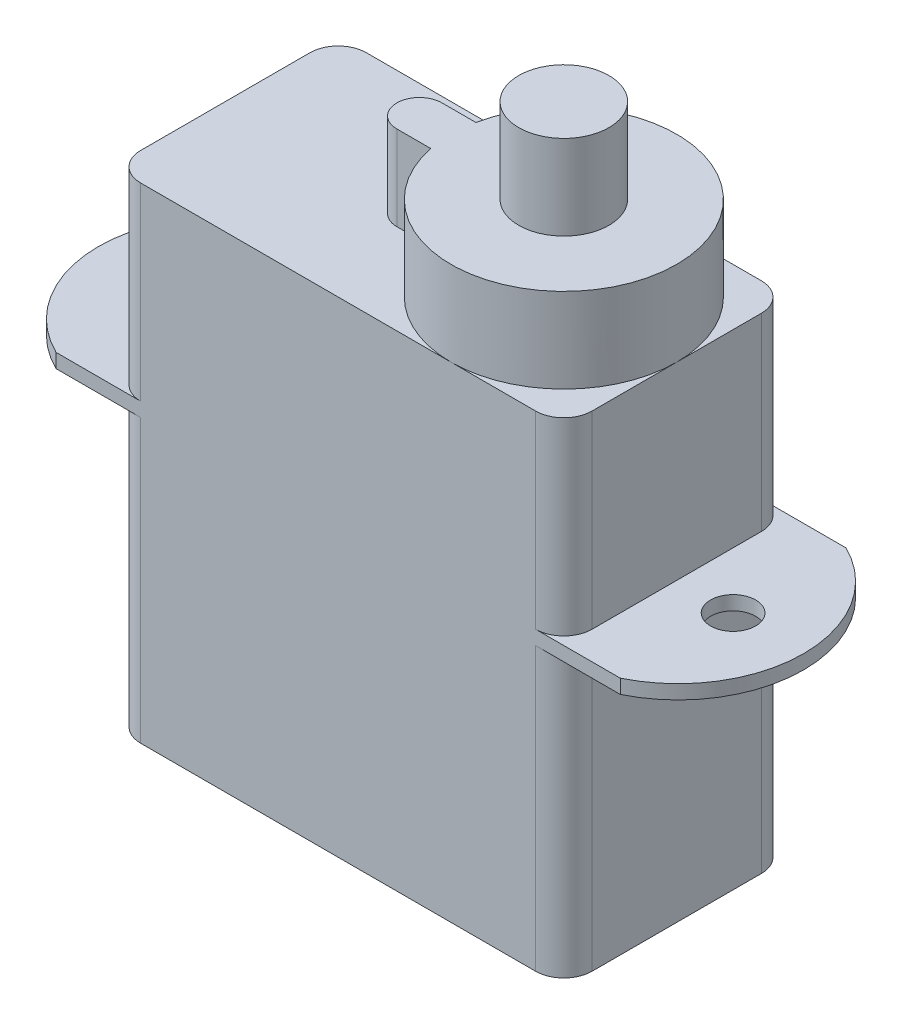
ISO-10303-21;
HEADER;
FILE_DESCRIPTION(('STEP AP214'),'2;1');
FILE_NAME('part.step','',(''),(''),'','','');
FILE_SCHEMA(('AUTOMOTIVE_DESIGN { 1 0 10303 214 1 1 1 1 }'));
ENDSEC;
DATA;
#1=APPLICATION_CONTEXT('core data for automotive mechanical design processes');
#2=APPLICATION_PROTOCOL_DEFINITION('international standard','automotive_design',2000,#1);
#3=PRODUCT_CONTEXT('',#1,'mechanical');
#4=PRODUCT('Part','Part','',(#3));
#5=PRODUCT_RELATED_PRODUCT_CATEGORY('part','',(#4));
#6=PRODUCT_DEFINITION_FORMATION('','',#4);
#7=PRODUCT_DEFINITION_CONTEXT('part definition',#1,'design');
#8=PRODUCT_DEFINITION('design','',#6,#7);
#9=PRODUCT_DEFINITION_SHAPE('','',#8);
#10=(LENGTH_UNIT() NAMED_UNIT(*) SI_UNIT(.MILLI.,.METRE.));
#11=(NAMED_UNIT(*) PLANE_ANGLE_UNIT() SI_UNIT($,.RADIAN.));
#12=(NAMED_UNIT(*) SI_UNIT($,.STERADIAN.) SOLID_ANGLE_UNIT());
#13=UNCERTAINTY_MEASURE_WITH_UNIT(LENGTH_MEASURE(1.E-05),#10,'distance_accuracy_value','');
#14=(GEOMETRIC_REPRESENTATION_CONTEXT(3) GLOBAL_UNCERTAINTY_ASSIGNED_CONTEXT((#13)) GLOBAL_UNIT_ASSIGNED_CONTEXT((#10,
#11,#12)) REPRESENTATION_CONTEXT('',''));
#15=CARTESIAN_POINT('',(0.,0.,0.));
#16=DIRECTION('',(0.,0.,1.));
#17=DIRECTION('',(1.,0.,0.));
#18=AXIS2_PLACEMENT_3D('',#15,#16,#17);
#19=CARTESIAN_POINT('',(-7.,17.2,-3.));
#20=DIRECTION('',(0.,1.,0.));
#21=DIRECTION('',(0.,0.,1.));
#22=AXIS2_PLACEMENT_3D('',#19,#20,#21);
#23=PLANE('',#22);
#24=CARTESIAN_POINT('',(4.,17.2,0.));
#25=DIRECTION('',(0.,1.,0.));
#26=DIRECTION('',(0.,0.,1.));
#27=AXIS2_PLACEMENT_3D('',#24,#25,#26);
#28=CIRCLE('',#27,4.);
#29=CARTESIAN_POINT('',(8.,17.2,0.));
#30=VERTEX_POINT('',#29);
#31=CARTESIAN_POINT('',(4.,17.2,-4.));
#32=VERTEX_POINT('',#31);
#33=EDGE_CURVE('E11',#30,#32,#28,.T.);
#34=ORIENTED_EDGE('',*,*,#33,.F.);
#35=DIRECTION('',(0.,0.,-1.));
#36=VECTOR('',#35,1.);
#37=CARTESIAN_POINT('',(8.,17.2,3.));
#38=LINE('',#37,#36);
#39=CARTESIAN_POINT('',(8.,17.2,-3.));
#40=VERTEX_POINT('',#39);
#41=EDGE_CURVE('E266',#30,#40,#38,.T.);
#42=ORIENTED_EDGE('',*,*,#41,.T.);
#43=CARTESIAN_POINT('',(7.,17.2,-3.));
#44=DIRECTION('',(0.,1.,0.));
#45=DIRECTION('',(0.,0.,1.));
#46=AXIS2_PLACEMENT_3D('',#43,#44,#45);
#47=CIRCLE('',#46,1.);
#48=CARTESIAN_POINT('',(7.,17.2,-4.));
#49=VERTEX_POINT('',#48);
#50=EDGE_CURVE('E271',#40,#49,#47,.T.);
#51=ORIENTED_EDGE('',*,*,#50,.T.);
#52=DIRECTION('',(-1.,0.,0.));
#53=VECTOR('',#52,1.);
#54=CARTESIAN_POINT('',(7.,17.2,-4.));
#55=LINE('',#54,#53);
#56=EDGE_CURVE('E275',#49,#32,#55,.T.);
#57=ORIENTED_EDGE('',*,*,#56,.T.);
#58=EDGE_LOOP('',(#34,#42,#51,#57));
#59=FACE_BOUND('',#58,.T.);
#60=ADVANCED_FACE('F39',(#59),#23,.T.);
#61=CARTESIAN_POINT('',(0.080816411546912,17.2,-0.8));
#62=VERTEX_POINT('',#61);
#63=EDGE_CURVE('E49',#32,#62,#28,.T.);
#64=ORIENTED_EDGE('',*,*,#63,.F.);
#65=CARTESIAN_POINT('',(-7.,17.2,-4.));
#66=VERTEX_POINT('',#65);
#67=EDGE_CURVE('E274',#32,#66,#55,.T.);
#68=ORIENTED_EDGE('',*,*,#67,.T.);
#69=CARTESIAN_POINT('',(-7.,17.2,-3.));
#70=DIRECTION('',(0.,1.,0.));
#71=DIRECTION('',(0.,0.,1.));
#72=AXIS2_PLACEMENT_3D('',#69,#70,#71);
#73=CIRCLE('',#72,1.);
#74=CARTESIAN_POINT('',(-8.,17.2,-3.));
#75=VERTEX_POINT('',#74);
#76=EDGE_CURVE('E247',#66,#75,#73,.T.);
#77=ORIENTED_EDGE('',*,*,#76,.T.);
#78=DIRECTION('',(0.,0.,1.));
#79=VECTOR('',#78,1.);
#80=CARTESIAN_POINT('',(-8.,17.2,-3.));
#81=LINE('',#80,#79);
#82=CARTESIAN_POINT('',(-8.,17.2,3.));
#83=VERTEX_POINT('',#82);
#84=EDGE_CURVE('E251',#75,#83,#81,.T.);
#85=ORIENTED_EDGE('',*,*,#84,.T.);
#86=CARTESIAN_POINT('',(-7.,17.2,3.));
#87=DIRECTION('',(0.,1.,0.));
#88=DIRECTION('',(0.,0.,1.));
#89=AXIS2_PLACEMENT_3D('',#86,#87,#88);
#90=CIRCLE('',#89,1.);
#91=CARTESIAN_POINT('',(-7.,17.2,4.));
#92=VERTEX_POINT('',#91);
#93=EDGE_CURVE('E255',#83,#92,#90,.T.);
#94=ORIENTED_EDGE('',*,*,#93,.T.);
#95=DIRECTION('',(1.,0.,0.));
#96=VECTOR('',#95,1.);
#97=CARTESIAN_POINT('',(-7.,17.2,4.));
#98=LINE('',#97,#96);
#99=CARTESIAN_POINT('',(4.,17.2,4.));
#100=VERTEX_POINT('',#99);
#101=EDGE_CURVE('E259',#92,#100,#98,.T.);
#102=ORIENTED_EDGE('',*,*,#101,.T.);
#103=CARTESIAN_POINT('',(0.0808164115469112,17.2,0.800000000000001));
#104=VERTEX_POINT('',#103);
#105=EDGE_CURVE('E51',#104,#100,#28,.T.);
#106=ORIENTED_EDGE('',*,*,#105,.F.);
#107=DIRECTION('',(1.,0.,0.));
#108=VECTOR('',#107,1.);
#109=CARTESIAN_POINT('',(-1.11918358845309,17.2,0.8));
#110=LINE('',#109,#108);
#111=CARTESIAN_POINT('',(-1.11918358845309,17.2,0.8));
#112=VERTEX_POINT('',#111);
#113=EDGE_CURVE('E484',#112,#104,#110,.T.);
#114=ORIENTED_EDGE('',*,*,#113,.F.);
#115=CARTESIAN_POINT('',(-1.11918358845309,17.2,0.));
#116=DIRECTION('',(0.,1.,0.));
#117=DIRECTION('',(0.,0.,1.));
#118=AXIS2_PLACEMENT_3D('',#115,#116,#117);
#119=CIRCLE('',#118,0.8);
#120=CARTESIAN_POINT('',(-1.11918358845309,17.2,-0.8));
#121=VERTEX_POINT('',#120);
#122=EDGE_CURVE('E63',#121,#112,#119,.T.);
#123=ORIENTED_EDGE('',*,*,#122,.F.);
#124=DIRECTION('',(-1.,0.,0.));
#125=VECTOR('',#124,1.);
#126=CARTESIAN_POINT('',(-1.11918358845309,17.2,-0.8));
#127=LINE('',#126,#125);
#128=EDGE_CURVE('E58',#62,#121,#127,.T.);
#129=ORIENTED_EDGE('',*,*,#128,.F.);
#130=EDGE_LOOP('',(#64,#68,#77,#85,#94,#102,#106,#114,#123,#129));
#131=FACE_BOUND('',#130,.T.);
#132=ADVANCED_FACE('F522',(#131),#23,.T.);
#133=CARTESIAN_POINT('',(8.05,10.5,0.));
#134=DIRECTION('',(0.,-1.,0.));
#135=DIRECTION('',(0.,0.,-1.));
#136=AXIS2_PLACEMENT_3D('',#133,#134,#135);
#137=PLANE('',#136);
#138=CARTESIAN_POINT('',(10.,10.5,0.));
#139=DIRECTION('',(0.,1.,0.));
#140=DIRECTION('',(0.,0.,-1.));
#141=AXIS2_PLACEMENT_3D('',#138,#139,#140);
#142=CIRCLE('',#141,0.800000000000001);
#143=CARTESIAN_POINT('',(10.,10.5,-0.800000000000001));
#144=VERTEX_POINT('',#143);
#145=EDGE_CURVE('E330',#144,#144,#142,.T.);
#146=ORIENTED_EDGE('',*,*,#145,.F.);
#147=EDGE_LOOP('',(#146));
#148=FACE_BOUND('',#147,.T.);
#149=CARTESIAN_POINT('',(7.,10.5,-3.));
#150=DIRECTION('',(0.,1.,0.));
#151=DIRECTION('',(0.,0.,1.));
#152=AXIS2_PLACEMENT_3D('',#149,#150,#151);
#153=CIRCLE('',#152,1.);
#154=CARTESIAN_POINT('',(8.,10.5,-3.));
#155=VERTEX_POINT('',#154);
#156=CARTESIAN_POINT('',(7.,10.5,-4.));
#157=VERTEX_POINT('',#156);
#158=EDGE_CURVE('E252',#155,#157,#153,.T.);
#159=ORIENTED_EDGE('',*,*,#158,.F.);
#160=DIRECTION('',(0.,0.,-1.));
#161=VECTOR('',#160,1.);
#162=CARTESIAN_POINT('',(8.,10.5,3.));
#163=LINE('',#162,#161);
#164=CARTESIAN_POINT('',(8.,10.5,3.));
#165=VERTEX_POINT('',#164);
#166=EDGE_CURVE('E291',#165,#155,#163,.T.);
#167=ORIENTED_EDGE('',*,*,#166,.F.);
#168=CARTESIAN_POINT('',(7.,10.5,3.));
#169=DIRECTION('',(0.,1.,0.));
#170=DIRECTION('',(0.,0.,1.));
#171=AXIS2_PLACEMENT_3D('',#168,#169,#170);
#172=CIRCLE('',#171,1.);
#173=CARTESIAN_POINT('',(7.,10.5,4.));
#174=VERTEX_POINT('',#173);
#175=EDGE_CURVE('E287',#174,#165,#172,.T.);
#176=ORIENTED_EDGE('',*,*,#175,.F.);
#177=DIRECTION('',(1.,0.,0.));
#178=VECTOR('',#177,1.);
#179=CARTESIAN_POINT('',(-10.,10.5,4.));
#180=LINE('',#179,#178);
#181=CARTESIAN_POINT('',(10.,10.5,4.));
#182=VERTEX_POINT('',#181);
#183=EDGE_CURVE('E358',#174,#182,#180,.T.);
#184=ORIENTED_EDGE('',*,*,#183,.T.);
#185=CARTESIAN_POINT('',(8.05,10.5,0.));
#186=DIRECTION('',(0.,1.,0.));
#187=DIRECTION('',(0.,0.,-1.));
#188=AXIS2_PLACEMENT_3D('',#185,#186,#187);
#189=CIRCLE('',#188,4.45);
#190=CARTESIAN_POINT('',(10.,10.5,-4.));
#191=VERTEX_POINT('',#190);
#192=EDGE_CURVE('E346',#182,#191,#189,.T.);
#193=ORIENTED_EDGE('',*,*,#192,.T.);
#194=DIRECTION('',(-1.,0.,0.));
#195=VECTOR('',#194,1.);
#196=CARTESIAN_POINT('',(-10.,10.5,-4.));
#197=LINE('',#196,#195);
#198=EDGE_CURVE('E352',#191,#157,#197,.T.);
#199=ORIENTED_EDGE('',*,*,#198,.T.);
#200=EDGE_LOOP('',(#159,#167,#176,#184,#193,#199));
#201=FACE_BOUND('',#200,.T.);
#202=ADVANCED_FACE('F529',(#148,#201),#137,.F.);
#203=CARTESIAN_POINT('',(-10.,10.5,0.));
#204=DIRECTION('',(0.,1.,0.));
#205=DIRECTION('',(0.,0.,1.));
#206=AXIS2_PLACEMENT_3D('',#203,#204,#205);
#207=CIRCLE('',#206,0.800000000000001);
#208=CARTESIAN_POINT('',(-10.,10.5,0.800000000000001));
#209=VERTEX_POINT('',#208);
#210=EDGE_CURVE('E338',#209,#209,#207,.T.);
#211=ORIENTED_EDGE('',*,*,#210,.F.);
#212=EDGE_LOOP('',(#211));
#213=FACE_BOUND('',#212,.T.);
#214=CARTESIAN_POINT('',(-7.,10.5,-3.));
#215=DIRECTION('',(0.,1.,0.));
#216=DIRECTION('',(0.,0.,1.));
#217=AXIS2_PLACEMENT_3D('',#214,#215,#216);
#218=CIRCLE('',#217,1.);
#219=CARTESIAN_POINT('',(-7.,10.5,-4.));
#220=VERTEX_POINT('',#219);
#221=CARTESIAN_POINT('',(-8.,10.5,-3.));
#222=VERTEX_POINT('',#221);
#223=EDGE_CURVE('E236',#220,#222,#218,.T.);
#224=ORIENTED_EDGE('',*,*,#223,.F.);
#225=CARTESIAN_POINT('',(-10.,10.5,-4.));
#226=VERTEX_POINT('',#225);
#227=EDGE_CURVE('E350',#220,#226,#197,.T.);
#228=ORIENTED_EDGE('',*,*,#227,.T.);
#229=CARTESIAN_POINT('',(-8.05,10.5,0.));
#230=DIRECTION('',(0.,1.,0.));
#231=DIRECTION('',(0.,0.,1.));
#232=AXIS2_PLACEMENT_3D('',#229,#230,#231);
#233=CIRCLE('',#232,4.45);
#234=CARTESIAN_POINT('',(-10.,10.5,4.));
#235=VERTEX_POINT('',#234);
#236=EDGE_CURVE('E355',#226,#235,#233,.T.);
#237=ORIENTED_EDGE('',*,*,#236,.T.);
#238=CARTESIAN_POINT('',(-7.,10.5,4.));
#239=VERTEX_POINT('',#238);
#240=EDGE_CURVE('E359',#235,#239,#180,.T.);
#241=ORIENTED_EDGE('',*,*,#240,.T.);
#242=CARTESIAN_POINT('',(-7.,10.5,3.));
#243=DIRECTION('',(0.,1.,0.));
#244=DIRECTION('',(0.,0.,1.));
#245=AXIS2_PLACEMENT_3D('',#242,#243,#244);
#246=CIRCLE('',#245,1.);
#247=CARTESIAN_POINT('',(-8.,10.5,3.));
#248=VERTEX_POINT('',#247);
#249=EDGE_CURVE('E283',#248,#239,#246,.T.);
#250=ORIENTED_EDGE('',*,*,#249,.F.);
#251=DIRECTION('',(0.,0.,1.));
#252=VECTOR('',#251,1.);
#253=CARTESIAN_POINT('',(-8.,10.5,-3.));
#254=LINE('',#253,#252);
#255=EDGE_CURVE('E241',#222,#248,#254,.T.);
#256=ORIENTED_EDGE('',*,*,#255,.F.);
#257=EDGE_LOOP('',(#224,#228,#237,#241,#250,#256));
#258=FACE_BOUND('',#257,.T.);
#259=ADVANCED_FACE('F559',(#213,#258),#137,.F.);
#260=CARTESIAN_POINT('',(7.,10.,3.));
#261=DIRECTION('',(0.,-1.,0.));
#262=DIRECTION('',(0.,0.,-1.));
#263=AXIS2_PLACEMENT_3D('',#260,#261,#262);
#264=CYLINDRICAL_SURFACE('',#263,1.);
#265=CARTESIAN_POINT('',(7.,0.,3.));
#266=DIRECTION('',(0.,1.,0.));
#267=DIRECTION('',(0.,0.,1.));
#268=AXIS2_PLACEMENT_3D('',#265,#266,#267);
#269=CIRCLE('',#268,1.);
#270=CARTESIAN_POINT('',(7.,0.,4.));
#271=VERTEX_POINT('',#270);
#272=CARTESIAN_POINT('',(8.,0.,3.));
#273=VERTEX_POINT('',#272);
#274=EDGE_CURVE('E393',#271,#273,#269,.T.);
#275=ORIENTED_EDGE('',*,*,#274,.T.);
#276=DIRECTION('',(0.,-1.,0.));
#277=VECTOR('',#276,1.);
#278=CARTESIAN_POINT('',(8.,10.,3.));
#279=LINE('',#278,#277);
#280=CARTESIAN_POINT('',(8.,10.,3.));
#281=VERTEX_POINT('',#280);
#282=EDGE_CURVE('E43',#281,#273,#279,.T.);
#283=ORIENTED_EDGE('',*,*,#282,.F.);
#284=CARTESIAN_POINT('',(7.,10.,3.));
#285=DIRECTION('',(0.,1.,0.));
#286=DIRECTION('',(0.,0.,1.));
#287=AXIS2_PLACEMENT_3D('',#284,#285,#286);
#288=CIRCLE('',#287,1.);
#289=CARTESIAN_POINT('',(7.,10.,4.));
#290=VERTEX_POINT('',#289);
#291=EDGE_CURVE('E394',#290,#281,#288,.T.);
#292=ORIENTED_EDGE('',*,*,#291,.F.);
#293=DIRECTION('',(0.,-1.,0.));
#294=VECTOR('',#293,1.);
#295=CARTESIAN_POINT('',(7.,10.,4.));
#296=LINE('',#295,#294);
#297=EDGE_CURVE('E419',#290,#271,#296,.T.);
#298=ORIENTED_EDGE('',*,*,#297,.T.);
#299=EDGE_LOOP('',(#275,#283,#292,#298));
#300=FACE_BOUND('',#299,.T.);
#301=ADVANCED_FACE('F41',(#300),#264,.T.);
#302=CARTESIAN_POINT('',(8.,10.,3.));
#303=DIRECTION('',(-1.,0.,0.));
#304=DIRECTION('',(0.,0.,1.));
#305=AXIS2_PLACEMENT_3D('',#302,#303,#304);
#306=PLANE('',#305);
#307=DIRECTION('',(0.,0.,-1.));
#308=VECTOR('',#307,1.);
#309=CARTESIAN_POINT('',(8.,0.,3.));
#310=LINE('',#309,#308);
#311=CARTESIAN_POINT('',(8.,0.,-3.));
#312=VERTEX_POINT('',#311);
#313=EDGE_CURVE('E423',#273,#312,#310,.T.);
#314=ORIENTED_EDGE('',*,*,#313,.T.);
#315=DIRECTION('',(0.,-1.,0.));
#316=VECTOR('',#315,1.);
#317=CARTESIAN_POINT('',(8.,10.,-3.));
#318=LINE('',#317,#316);
#319=CARTESIAN_POINT('',(8.,10.,-3.));
#320=VERTEX_POINT('',#319);
#321=EDGE_CURVE('E465',#320,#312,#318,.T.);
#322=ORIENTED_EDGE('',*,*,#321,.F.);
#323=DIRECTION('',(0.,0.,-1.));
#324=VECTOR('',#323,1.);
#325=CARTESIAN_POINT('',(8.,10.,3.));
#326=LINE('',#325,#324);
#327=EDGE_CURVE('E398',#281,#320,#326,.T.);
#328=ORIENTED_EDGE('',*,*,#327,.F.);
#329=ORIENTED_EDGE('',*,*,#282,.T.);
#330=EDGE_LOOP('',(#314,#322,#328,#329));
#331=FACE_BOUND('',#330,.T.);
#332=ADVANCED_FACE('F664',(#331),#306,.F.);
#333=CARTESIAN_POINT('',(7.,10.,-3.));
#334=DIRECTION('',(0.,-1.,0.));
#335=DIRECTION('',(0.,0.,-1.));
#336=AXIS2_PLACEMENT_3D('',#333,#334,#335);
#337=CYLINDRICAL_SURFACE('',#336,1.);
#338=CARTESIAN_POINT('',(7.,0.,-3.));
#339=DIRECTION('',(0.,1.,0.));
#340=DIRECTION('',(0.,0.,-1.));
#341=AXIS2_PLACEMENT_3D('',#338,#339,#340);
#342=CIRCLE('',#341,1.);
#343=CARTESIAN_POINT('',(7.,0.,-4.));
#344=VERTEX_POINT('',#343);
#345=EDGE_CURVE('E426',#312,#344,#342,.T.);
#346=ORIENTED_EDGE('',*,*,#345,.T.);
#347=DIRECTION('',(0.,-1.,0.));
#348=VECTOR('',#347,1.);
#349=CARTESIAN_POINT('',(7.,10.,-4.));
#350=LINE('',#349,#348);
#351=CARTESIAN_POINT('',(7.,10.,-4.));
#352=VERTEX_POINT('',#351);
#353=EDGE_CURVE('E462',#352,#344,#350,.T.);
#354=ORIENTED_EDGE('',*,*,#353,.F.);
#355=CARTESIAN_POINT('',(7.,10.,-3.));
#356=DIRECTION('',(0.,1.,0.));
#357=DIRECTION('',(0.,0.,-1.));
#358=AXIS2_PLACEMENT_3D('',#355,#356,#357);
#359=CIRCLE('',#358,1.);
#360=EDGE_CURVE('E403',#320,#352,#359,.T.);
#361=ORIENTED_EDGE('',*,*,#360,.F.);
#362=ORIENTED_EDGE('',*,*,#321,.T.);
#363=EDGE_LOOP('',(#346,#354,#361,#362));
#364=FACE_BOUND('',#363,.T.);
#365=ADVANCED_FACE('F662',(#364),#337,.T.);
#366=CARTESIAN_POINT('',(-7.,10.,-4.));
#367=DIRECTION('',(0.,0.,1.));
#368=DIRECTION('',(1.,0.,0.));
#369=AXIS2_PLACEMENT_3D('',#366,#367,#368);
#370=PLANE('',#369);
#371=DIRECTION('',(-1.,0.,0.));
#372=VECTOR('',#371,1.);
#373=CARTESIAN_POINT('',(-7.,0.,-4.));
#374=LINE('',#373,#372);
#375=CARTESIAN_POINT('',(-7.,0.,-4.));
#376=VERTEX_POINT('',#375);
#377=EDGE_CURVE('E429',#344,#376,#374,.T.);
#378=ORIENTED_EDGE('',*,*,#377,.T.);
#379=DIRECTION('',(0.,-1.,0.));
#380=VECTOR('',#379,1.);
#381=CARTESIAN_POINT('',(-7.,10.,-4.));
#382=LINE('',#381,#380);
#383=CARTESIAN_POINT('',(-7.,10.,-4.));
#384=VERTEX_POINT('',#383);
#385=EDGE_CURVE('E458',#384,#376,#382,.T.);
#386=ORIENTED_EDGE('',*,*,#385,.F.);
#387=DIRECTION('',(-1.,0.,0.));
#388=VECTOR('',#387,1.);
#389=CARTESIAN_POINT('',(-10.,10.,-4.));
#390=LINE('',#389,#388);
#391=CARTESIAN_POINT('',(-10.,10.,-4.));
#392=VERTEX_POINT('',#391);
#393=EDGE_CURVE('E366',#384,#392,#390,.T.);
#394=ORIENTED_EDGE('',*,*,#393,.T.);
#395=DIRECTION('',(0.,-1.,0.));
#396=VECTOR('',#395,1.);
#397=CARTESIAN_POINT('',(-10.,10.5,-4.));
#398=LINE('',#397,#396);
#399=EDGE_CURVE('E385',#226,#392,#398,.T.);
#400=ORIENTED_EDGE('',*,*,#399,.F.);
#401=ORIENTED_EDGE('',*,*,#227,.F.);
#402=DIRECTION('',(0.,-1.,0.));
#403=VECTOR('',#402,1.);
#404=CARTESIAN_POINT('',(-7.,17.2,-4.));
#405=LINE('',#404,#403);
#406=EDGE_CURVE('E278',#66,#220,#405,.T.);
#407=ORIENTED_EDGE('',*,*,#406,.F.);
#408=ORIENTED_EDGE('',*,*,#67,.F.);
#409=ORIENTED_EDGE('',*,*,#56,.F.);
#410=DIRECTION('',(0.,-1.,0.));
#411=VECTOR('',#410,1.);
#412=CARTESIAN_POINT('',(7.,17.2,-4.));
#413=LINE('',#412,#411);
#414=EDGE_CURVE('E301',#49,#157,#413,.T.);
#415=ORIENTED_EDGE('',*,*,#414,.T.);
#416=ORIENTED_EDGE('',*,*,#198,.F.);
#417=DIRECTION('',(0.,-1.,0.));
#418=VECTOR('',#417,1.);
#419=CARTESIAN_POINT('',(10.,10.5,-4.));
#420=LINE('',#419,#418);
#421=CARTESIAN_POINT('',(10.,10.,-4.));
#422=VERTEX_POINT('',#421);
#423=EDGE_CURVE('E389',#191,#422,#420,.T.);
#424=ORIENTED_EDGE('',*,*,#423,.T.);
#425=EDGE_CURVE('E367',#422,#352,#390,.T.);
#426=ORIENTED_EDGE('',*,*,#425,.T.);
#427=ORIENTED_EDGE('',*,*,#353,.T.);
#428=EDGE_LOOP('',(#378,#386,#394,#400,#401,#407,#408,#409,#415,#416,#424,#426,#427));
#429=FACE_BOUND('',#428,.T.);
#430=ADVANCED_FACE('F590',(#429),#370,.F.);
#431=CARTESIAN_POINT('',(-7.,10.,-3.));
#432=DIRECTION('',(0.,-1.,0.));
#433=DIRECTION('',(0.,0.,-1.));
#434=AXIS2_PLACEMENT_3D('',#431,#432,#433);
#435=CYLINDRICAL_SURFACE('',#434,1.);
#436=CARTESIAN_POINT('',(-7.,0.,-3.));
#437=DIRECTION('',(0.,1.,0.));
#438=DIRECTION('',(0.,0.,-1.));
#439=AXIS2_PLACEMENT_3D('',#436,#437,#438);
#440=CIRCLE('',#439,1.);
#441=CARTESIAN_POINT('',(-8.,0.,-3.));
#442=VERTEX_POINT('',#441);
#443=EDGE_CURVE('E432',#376,#442,#440,.T.);
#444=ORIENTED_EDGE('',*,*,#443,.T.);
#445=DIRECTION('',(0.,-1.,0.));
#446=VECTOR('',#445,1.);
#447=CARTESIAN_POINT('',(-8.,10.,-3.));
#448=LINE('',#447,#446);
#449=CARTESIAN_POINT('',(-8.,10.,-3.));
#450=VERTEX_POINT('',#449);
#451=EDGE_CURVE('E454',#450,#442,#448,.T.);
#452=ORIENTED_EDGE('',*,*,#451,.F.);
#453=CARTESIAN_POINT('',(-7.,10.,-3.));
#454=DIRECTION('',(0.,1.,0.));
#455=DIRECTION('',(0.,0.,-1.));
#456=AXIS2_PLACEMENT_3D('',#453,#454,#455);
#457=CIRCLE('',#456,1.);
#458=EDGE_CURVE('E407',#384,#450,#457,.T.);
#459=ORIENTED_EDGE('',*,*,#458,.F.);
#460=ORIENTED_EDGE('',*,*,#385,.T.);
#461=EDGE_LOOP('',(#444,#452,#459,#460));
#462=FACE_BOUND('',#461,.T.);
#463=ADVANCED_FACE('F655',(#462),#435,.T.);
#464=CARTESIAN_POINT('',(-8.,10.,3.));
#465=DIRECTION('',(1.,0.,0.));
#466=DIRECTION('',(0.,0.,-1.));
#467=AXIS2_PLACEMENT_3D('',#464,#465,#466);
#468=PLANE('',#467);
#469=DIRECTION('',(0.,0.,1.));
#470=VECTOR('',#469,1.);
#471=CARTESIAN_POINT('',(-8.,0.,3.));
#472=LINE('',#471,#470);
#473=CARTESIAN_POINT('',(-8.,0.,3.));
#474=VERTEX_POINT('',#473);
#475=EDGE_CURVE('E435',#442,#474,#472,.T.);
#476=ORIENTED_EDGE('',*,*,#475,.T.);
#477=DIRECTION('',(0.,-1.,0.));
#478=VECTOR('',#477,1.);
#479=CARTESIAN_POINT('',(-8.,10.,3.));
#480=LINE('',#479,#478);
#481=CARTESIAN_POINT('',(-8.,10.,3.));
#482=VERTEX_POINT('',#481);
#483=EDGE_CURVE('E450',#482,#474,#480,.T.);
#484=ORIENTED_EDGE('',*,*,#483,.F.);
#485=DIRECTION('',(0.,0.,1.));
#486=VECTOR('',#485,1.);
#487=CARTESIAN_POINT('',(-8.,10.,3.));
#488=LINE('',#487,#486);
#489=EDGE_CURVE('E411',#450,#482,#488,.T.);
#490=ORIENTED_EDGE('',*,*,#489,.F.);
#491=ORIENTED_EDGE('',*,*,#451,.T.);
#492=EDGE_LOOP('',(#476,#484,#490,#491));
#493=FACE_BOUND('',#492,.T.);
#494=ADVANCED_FACE('F652',(#493),#468,.F.);
#495=CARTESIAN_POINT('',(-7.,10.,3.));
#496=DIRECTION('',(0.,-1.,0.));
#497=DIRECTION('',(0.,0.,-1.));
#498=AXIS2_PLACEMENT_3D('',#495,#496,#497);
#499=CYLINDRICAL_SURFACE('',#498,1.);
#500=CARTESIAN_POINT('',(-7.,0.,3.));
#501=DIRECTION('',(0.,1.,0.));
#502=DIRECTION('',(0.,0.,-1.));
#503=AXIS2_PLACEMENT_3D('',#500,#501,#502);
#504=CIRCLE('',#503,1.);
#505=CARTESIAN_POINT('',(-7.,0.,4.));
#506=VERTEX_POINT('',#505);
#507=EDGE_CURVE('E438',#474,#506,#504,.T.);
#508=ORIENTED_EDGE('',*,*,#507,.T.);
#509=DIRECTION('',(0.,-1.,0.));
#510=VECTOR('',#509,1.);
#511=CARTESIAN_POINT('',(-7.,10.,4.));
#512=LINE('',#511,#510);
#513=CARTESIAN_POINT('',(-7.,10.,4.));
#514=VERTEX_POINT('',#513);
#515=EDGE_CURVE('E446',#514,#506,#512,.T.);
#516=ORIENTED_EDGE('',*,*,#515,.F.);
#517=CARTESIAN_POINT('',(-7.,10.,3.));
#518=DIRECTION('',(0.,1.,0.));
#519=DIRECTION('',(0.,0.,-1.));
#520=AXIS2_PLACEMENT_3D('',#517,#518,#519);
#521=CIRCLE('',#520,1.);
#522=EDGE_CURVE('E415',#482,#514,#521,.T.);
#523=ORIENTED_EDGE('',*,*,#522,.F.);
#524=ORIENTED_EDGE('',*,*,#483,.T.);
#525=EDGE_LOOP('',(#508,#516,#523,#524));
#526=FACE_BOUND('',#525,.T.);
#527=ADVANCED_FACE('F649',(#526),#499,.T.);
#528=CARTESIAN_POINT('',(-7.,10.,4.));
#529=DIRECTION('',(0.,0.,-1.));
#530=DIRECTION('',(-1.,0.,0.));
#531=AXIS2_PLACEMENT_3D('',#528,#529,#530);
#532=PLANE('',#531);
#533=DIRECTION('',(1.,0.,0.));
#534=VECTOR('',#533,1.);
#535=CARTESIAN_POINT('',(-7.,0.,4.));
#536=LINE('',#535,#534);
#537=EDGE_CURVE('E399',#506,#271,#536,.T.);
#538=ORIENTED_EDGE('',*,*,#537,.T.);
#539=ORIENTED_EDGE('',*,*,#297,.F.);
#540=DIRECTION('',(1.,0.,0.));
#541=VECTOR('',#540,1.);
#542=CARTESIAN_POINT('',(-10.,10.,4.));
#543=LINE('',#542,#541);
#544=CARTESIAN_POINT('',(10.,10.,4.));
#545=VERTEX_POINT('',#544);
#546=EDGE_CURVE('E374',#290,#545,#543,.T.);
#547=ORIENTED_EDGE('',*,*,#546,.T.);
#548=DIRECTION('',(0.,-1.,0.));
#549=VECTOR('',#548,1.);
#550=CARTESIAN_POINT('',(10.,10.5,4.));
#551=LINE('',#550,#549);
#552=EDGE_CURVE('E362',#182,#545,#551,.T.);
#553=ORIENTED_EDGE('',*,*,#552,.F.);
#554=ORIENTED_EDGE('',*,*,#183,.F.);
#555=DIRECTION('',(0.,-1.,0.));
#556=VECTOR('',#555,1.);
#557=CARTESIAN_POINT('',(7.,17.2,4.));
#558=LINE('',#557,#556);
#559=CARTESIAN_POINT('',(7.,17.2,4.));
#560=VERTEX_POINT('',#559);
#561=EDGE_CURVE('E313',#560,#174,#558,.T.);
#562=ORIENTED_EDGE('',*,*,#561,.F.);
#563=EDGE_CURVE('E258',#100,#560,#98,.T.);
#564=ORIENTED_EDGE('',*,*,#563,.F.);
#565=ORIENTED_EDGE('',*,*,#101,.F.);
#566=DIRECTION('',(0.,-1.,0.));
#567=VECTOR('',#566,1.);
#568=CARTESIAN_POINT('',(-7.,17.2,4.));
#569=LINE('',#568,#567);
#570=EDGE_CURVE('E317',#92,#239,#569,.T.);
#571=ORIENTED_EDGE('',*,*,#570,.T.);
#572=ORIENTED_EDGE('',*,*,#240,.F.);
#573=DIRECTION('',(0.,-1.,0.));
#574=VECTOR('',#573,1.);
#575=CARTESIAN_POINT('',(-10.,10.5,4.));
#576=LINE('',#575,#574);
#577=CARTESIAN_POINT('',(-10.,10.,4.));
#578=VERTEX_POINT('',#577);
#579=EDGE_CURVE('E381',#235,#578,#576,.T.);
#580=ORIENTED_EDGE('',*,*,#579,.T.);
#581=EDGE_CURVE('E351',#578,#514,#543,.T.);
#582=ORIENTED_EDGE('',*,*,#581,.T.);
#583=ORIENTED_EDGE('',*,*,#515,.T.);
#584=EDGE_LOOP('',(#538,#539,#547,#553,#554,#562,#564,#565,#571,#572,#580,#582,#583));
#585=FACE_BOUND('',#584,.T.);
#586=ADVANCED_FACE('F546',(#585),#532,.F.);
#587=CARTESIAN_POINT('',(7.,0.,3.));
#588=DIRECTION('',(0.,1.,0.));
#589=DIRECTION('',(0.,0.,1.));
#590=AXIS2_PLACEMENT_3D('',#587,#588,#589);
#591=PLANE('',#590);
#592=ORIENTED_EDGE('',*,*,#274,.F.);
#593=ORIENTED_EDGE('',*,*,#537,.F.);
#594=ORIENTED_EDGE('',*,*,#507,.F.);
#595=ORIENTED_EDGE('',*,*,#475,.F.);
#596=ORIENTED_EDGE('',*,*,#443,.F.);
#597=ORIENTED_EDGE('',*,*,#377,.F.);
#598=ORIENTED_EDGE('',*,*,#345,.F.);
#599=ORIENTED_EDGE('',*,*,#313,.F.);
#600=EDGE_LOOP('',(#592,#593,#594,#595,#596,#597,#598,#599));
#601=FACE_BOUND('',#600,.T.);
#602=ADVANCED_FACE('F575',(#601),#591,.F.);
#603=CARTESIAN_POINT('',(8.05,10.,0.));
#604=DIRECTION('',(0.,-1.,0.));
#605=DIRECTION('',(0.,0.,-1.));
#606=AXIS2_PLACEMENT_3D('',#603,#604,#605);
#607=PLANE('',#606);
#608=CARTESIAN_POINT('',(10.,10.,0.));
#609=DIRECTION('',(0.,1.,0.));
#610=DIRECTION('',(0.,0.,-1.));
#611=AXIS2_PLACEMENT_3D('',#608,#609,#610);
#612=CIRCLE('',#611,0.800000000000001);
#613=CARTESIAN_POINT('',(10.,10.,-0.800000000000001));
#614=VERTEX_POINT('',#613);
#615=EDGE_CURVE('E329',#614,#614,#612,.T.);
#616=ORIENTED_EDGE('',*,*,#615,.T.);
#617=EDGE_LOOP('',(#616));
#618=FACE_BOUND('',#617,.T.);
#619=ORIENTED_EDGE('',*,*,#546,.F.);
#620=ORIENTED_EDGE('',*,*,#291,.T.);
#621=ORIENTED_EDGE('',*,*,#327,.T.);
#622=ORIENTED_EDGE('',*,*,#360,.T.);
#623=ORIENTED_EDGE('',*,*,#425,.F.);
#624=CARTESIAN_POINT('',(8.05,10.,0.));
#625=DIRECTION('',(0.,1.,0.));
#626=DIRECTION('',(0.,0.,-1.));
#627=AXIS2_PLACEMENT_3D('',#624,#625,#626);
#628=CIRCLE('',#627,4.45);
#629=EDGE_CURVE('E342',#545,#422,#628,.T.);
#630=ORIENTED_EDGE('',*,*,#629,.F.);
#631=EDGE_LOOP('',(#619,#620,#621,#622,#623,#630));
#632=FACE_BOUND('',#631,.T.);
#633=ADVANCED_FACE('F588',(#618,#632),#607,.T.);
#634=CARTESIAN_POINT('',(-10.,10.,0.));
#635=DIRECTION('',(0.,1.,0.));
#636=DIRECTION('',(0.,0.,1.));
#637=AXIS2_PLACEMENT_3D('',#634,#635,#636);
#638=CIRCLE('',#637,0.800000000000001);
#639=CARTESIAN_POINT('',(-10.,10.,0.800000000000001));
#640=VERTEX_POINT('',#639);
#641=EDGE_CURVE('E334',#640,#640,#638,.T.);
#642=ORIENTED_EDGE('',*,*,#641,.T.);
#643=EDGE_LOOP('',(#642));
#644=FACE_BOUND('',#643,.T.);
#645=ORIENTED_EDGE('',*,*,#393,.F.);
#646=ORIENTED_EDGE('',*,*,#458,.T.);
#647=ORIENTED_EDGE('',*,*,#489,.T.);
#648=ORIENTED_EDGE('',*,*,#522,.T.);
#649=ORIENTED_EDGE('',*,*,#581,.F.);
#650=CARTESIAN_POINT('',(-8.05,10.,0.));
#651=DIRECTION('',(0.,1.,0.));
#652=DIRECTION('',(0.,0.,1.));
#653=AXIS2_PLACEMENT_3D('',#650,#651,#652);
#654=CIRCLE('',#653,4.45);
#655=EDGE_CURVE('E371',#392,#578,#654,.T.);
#656=ORIENTED_EDGE('',*,*,#655,.F.);
#657=EDGE_LOOP('',(#645,#646,#647,#648,#649,#656));
#658=FACE_BOUND('',#657,.T.);
#659=ADVANCED_FACE('F568',(#644,#658),#607,.T.);
#660=CARTESIAN_POINT('',(8.05,10.5,0.));
#661=DIRECTION('',(0.,-1.,0.));
#662=DIRECTION('',(0.,0.,-1.));
#663=AXIS2_PLACEMENT_3D('',#660,#661,#662);
#664=CYLINDRICAL_SURFACE('',#663,4.45);
#665=ORIENTED_EDGE('',*,*,#629,.T.);
#666=ORIENTED_EDGE('',*,*,#423,.F.);
#667=ORIENTED_EDGE('',*,*,#192,.F.);
#668=ORIENTED_EDGE('',*,*,#552,.T.);
#669=EDGE_LOOP('',(#665,#666,#667,#668));
#670=FACE_BOUND('',#669,.T.);
#671=ADVANCED_FACE('F586',(#670),#664,.T.);
#672=CARTESIAN_POINT('',(-8.05,10.5,0.));
#673=DIRECTION('',(0.,-1.,0.));
#674=DIRECTION('',(0.,0.,-1.));
#675=AXIS2_PLACEMENT_3D('',#672,#673,#674);
#676=CYLINDRICAL_SURFACE('',#675,4.45);
#677=ORIENTED_EDGE('',*,*,#655,.T.);
#678=ORIENTED_EDGE('',*,*,#579,.F.);
#679=ORIENTED_EDGE('',*,*,#236,.F.);
#680=ORIENTED_EDGE('',*,*,#399,.T.);
#681=EDGE_LOOP('',(#677,#678,#679,#680));
#682=FACE_BOUND('',#681,.T.);
#683=ADVANCED_FACE('F564',(#682),#676,.T.);
#684=CARTESIAN_POINT('',(-10.,10.5,0.));
#685=DIRECTION('',(0.,-1.,0.));
#686=DIRECTION('',(0.,0.,-1.));
#687=AXIS2_PLACEMENT_3D('',#684,#685,#686);
#688=CYLINDRICAL_SURFACE('',#687,0.800000000000001);
#689=ORIENTED_EDGE('',*,*,#210,.T.);
#690=EDGE_LOOP('',(#689));
#691=FACE_BOUND('',#690,.T.);
#692=ORIENTED_EDGE('',*,*,#641,.F.);
#693=EDGE_LOOP('',(#692));
#694=FACE_BOUND('',#693,.T.);
#695=ADVANCED_FACE('F630',(#691,#694),#688,.F.);
#696=CARTESIAN_POINT('',(10.,10.5,0.));
#697=DIRECTION('',(0.,-1.,0.));
#698=DIRECTION('',(0.,0.,-1.));
#699=AXIS2_PLACEMENT_3D('',#696,#697,#698);
#700=CYLINDRICAL_SURFACE('',#699,0.800000000000001);
#701=ORIENTED_EDGE('',*,*,#145,.T.);
#702=EDGE_LOOP('',(#701));
#703=FACE_BOUND('',#702,.T.);
#704=ORIENTED_EDGE('',*,*,#615,.F.);
#705=EDGE_LOOP('',(#704));
#706=FACE_BOUND('',#705,.T.);
#707=ADVANCED_FACE('F624',(#703,#706),#700,.F.);
#708=CARTESIAN_POINT('',(-7.,17.2,-3.));
#709=DIRECTION('',(0.,-1.,0.));
#710=DIRECTION('',(0.,0.,-1.));
#711=AXIS2_PLACEMENT_3D('',#708,#709,#710);
#712=CYLINDRICAL_SURFACE('',#711,1.);
#713=ORIENTED_EDGE('',*,*,#223,.T.);
#714=DIRECTION('',(0.,-1.,0.));
#715=VECTOR('',#714,1.);
#716=CARTESIAN_POINT('',(-8.,17.2,-3.));
#717=LINE('',#716,#715);
#718=EDGE_CURVE('E325',#75,#222,#717,.T.);
#719=ORIENTED_EDGE('',*,*,#718,.F.);
#720=ORIENTED_EDGE('',*,*,#76,.F.);
#721=ORIENTED_EDGE('',*,*,#406,.T.);
#722=EDGE_LOOP('',(#713,#719,#720,#721));
#723=FACE_BOUND('',#722,.T.);
#724=ADVANCED_FACE('F613',(#723),#712,.T.);
#725=CARTESIAN_POINT('',(-8.,17.2,-3.));
#726=DIRECTION('',(1.,0.,0.));
#727=DIRECTION('',(0.,0.,-1.));
#728=AXIS2_PLACEMENT_3D('',#725,#726,#727);
#729=PLANE('',#728);
#730=ORIENTED_EDGE('',*,*,#255,.T.);
#731=DIRECTION('',(0.,-1.,0.));
#732=VECTOR('',#731,1.);
#733=CARTESIAN_POINT('',(-8.,17.2,3.));
#734=LINE('',#733,#732);
#735=EDGE_CURVE('E321',#83,#248,#734,.T.);
#736=ORIENTED_EDGE('',*,*,#735,.F.);
#737=ORIENTED_EDGE('',*,*,#84,.F.);
#738=ORIENTED_EDGE('',*,*,#718,.T.);
#739=EDGE_LOOP('',(#730,#736,#737,#738));
#740=FACE_BOUND('',#739,.T.);
#741=ADVANCED_FACE('F615',(#740),#729,.F.);
#742=CARTESIAN_POINT('',(-7.,17.2,3.));
#743=DIRECTION('',(0.,-1.,0.));
#744=DIRECTION('',(0.,0.,-1.));
#745=AXIS2_PLACEMENT_3D('',#742,#743,#744);
#746=CYLINDRICAL_SURFACE('',#745,1.);
#747=ORIENTED_EDGE('',*,*,#249,.T.);
#748=ORIENTED_EDGE('',*,*,#570,.F.);
#749=ORIENTED_EDGE('',*,*,#93,.F.);
#750=ORIENTED_EDGE('',*,*,#735,.T.);
#751=EDGE_LOOP('',(#747,#748,#749,#750));
#752=FACE_BOUND('',#751,.T.);
#753=ADVANCED_FACE('F554',(#752),#746,.T.);
#754=CARTESIAN_POINT('',(7.,17.2,3.));
#755=DIRECTION('',(0.,-1.,0.));
#756=DIRECTION('',(0.,0.,-1.));
#757=AXIS2_PLACEMENT_3D('',#754,#755,#756);
#758=CYLINDRICAL_SURFACE('',#757,1.);
#759=ORIENTED_EDGE('',*,*,#175,.T.);
#760=DIRECTION('',(0.,-1.,0.));
#761=VECTOR('',#760,1.);
#762=CARTESIAN_POINT('',(8.,17.2,3.));
#763=LINE('',#762,#761);
#764=CARTESIAN_POINT('',(8.,17.2,3.));
#765=VERTEX_POINT('',#764);
#766=EDGE_CURVE('E309',#765,#165,#763,.T.);
#767=ORIENTED_EDGE('',*,*,#766,.F.);
#768=CARTESIAN_POINT('',(7.,17.2,3.));
#769=DIRECTION('',(0.,1.,0.));
#770=DIRECTION('',(0.,0.,1.));
#771=AXIS2_PLACEMENT_3D('',#768,#769,#770);
#772=CIRCLE('',#771,1.);
#773=EDGE_CURVE('E263',#560,#765,#772,.T.);
#774=ORIENTED_EDGE('',*,*,#773,.F.);
#775=ORIENTED_EDGE('',*,*,#561,.T.);
#776=EDGE_LOOP('',(#759,#767,#774,#775));
#777=FACE_BOUND('',#776,.T.);
#778=ADVANCED_FACE('F622',(#777),#758,.T.);
#779=CARTESIAN_POINT('',(8.,17.2,3.));
#780=DIRECTION('',(-1.,0.,0.));
#781=DIRECTION('',(0.,0.,1.));
#782=AXIS2_PLACEMENT_3D('',#779,#780,#781);
#783=PLANE('',#782);
#784=ORIENTED_EDGE('',*,*,#166,.T.);
#785=DIRECTION('',(0.,-1.,0.));
#786=VECTOR('',#785,1.);
#787=CARTESIAN_POINT('',(8.,17.2,-3.));
#788=LINE('',#787,#786);
#789=EDGE_CURVE('E305',#40,#155,#788,.T.);
#790=ORIENTED_EDGE('',*,*,#789,.F.);
#791=ORIENTED_EDGE('',*,*,#41,.F.);
#792=EDGE_CURVE('E267',#765,#30,#38,.T.);
#793=ORIENTED_EDGE('',*,*,#792,.F.);
#794=ORIENTED_EDGE('',*,*,#766,.T.);
#795=EDGE_LOOP('',(#784,#790,#791,#793,#794));
#796=FACE_BOUND('',#795,.T.);
#797=ADVANCED_FACE('F539',(#796),#783,.F.);
#798=CARTESIAN_POINT('',(7.,17.2,-3.));
#799=DIRECTION('',(0.,-1.,0.));
#800=DIRECTION('',(0.,0.,-1.));
#801=AXIS2_PLACEMENT_3D('',#798,#799,#800);
#802=CYLINDRICAL_SURFACE('',#801,1.);
#803=ORIENTED_EDGE('',*,*,#158,.T.);
#804=ORIENTED_EDGE('',*,*,#414,.F.);
#805=ORIENTED_EDGE('',*,*,#50,.F.);
#806=ORIENTED_EDGE('',*,*,#789,.T.);
#807=EDGE_LOOP('',(#803,#804,#805,#806));
#808=FACE_BOUND('',#807,.T.);
#809=ADVANCED_FACE('F533',(#808),#802,.T.);
#810=EDGE_CURVE('E473',#100,#30,#28,.T.);
#811=ORIENTED_EDGE('',*,*,#810,.F.);
#812=ORIENTED_EDGE('',*,*,#563,.T.);
#813=ORIENTED_EDGE('',*,*,#773,.T.);
#814=ORIENTED_EDGE('',*,*,#792,.T.);
#815=EDGE_LOOP('',(#811,#812,#813,#814));
#816=FACE_BOUND('',#815,.T.);
#817=ADVANCED_FACE('F525',(#816),#23,.T.);
#818=CARTESIAN_POINT('',(-1.11918358845309,20.2,0.));
#819=DIRECTION('',(0.,-1.,0.));
#820=DIRECTION('',(0.,0.,-1.));
#821=AXIS2_PLACEMENT_3D('',#818,#819,#820);
#822=CYLINDRICAL_SURFACE('',#821,0.8);
#823=ORIENTED_EDGE('',*,*,#122,.T.);
#824=DIRECTION('',(0.,-1.,0.));
#825=VECTOR('',#824,1.);
#826=CARTESIAN_POINT('',(-1.11918358845309,20.2,0.8));
#827=LINE('',#826,#825);
#828=CARTESIAN_POINT('',(-1.11918358845309,20.2,0.8));
#829=VERTEX_POINT('',#828);
#830=EDGE_CURVE('E216',#829,#112,#827,.T.);
#831=ORIENTED_EDGE('',*,*,#830,.F.);
#832=CARTESIAN_POINT('',(-1.11918358845309,20.2,0.));
#833=DIRECTION('',(0.,1.,0.));
#834=DIRECTION('',(0.,0.,1.));
#835=AXIS2_PLACEMENT_3D('',#832,#833,#834);
#836=CIRCLE('',#835,0.8);
#837=CARTESIAN_POINT('',(-1.11918358845309,20.2,-0.8));
#838=VERTEX_POINT('',#837);
#839=EDGE_CURVE('E223',#838,#829,#836,.T.);
#840=ORIENTED_EDGE('',*,*,#839,.F.);
#841=DIRECTION('',(0.,-1.,0.));
#842=VECTOR('',#841,1.);
#843=CARTESIAN_POINT('',(-1.11918358845309,20.2,-0.8));
#844=LINE('',#843,#842);
#845=EDGE_CURVE('E493',#838,#121,#844,.T.);
#846=ORIENTED_EDGE('',*,*,#845,.T.);
#847=EDGE_LOOP('',(#823,#831,#840,#846));
#848=FACE_BOUND('',#847,.T.);
#849=ADVANCED_FACE('F234',(#848),#822,.T.);
#850=CARTESIAN_POINT('',(-1.11918358845309,20.2,0.8));
#851=DIRECTION('',(0.,0.,-1.));
#852=DIRECTION('',(-1.,0.,0.));
#853=AXIS2_PLACEMENT_3D('',#850,#851,#852);
#854=PLANE('',#853);
#855=ORIENTED_EDGE('',*,*,#113,.T.);
#856=DIRECTION('',(0.,-1.,0.));
#857=VECTOR('',#856,1.);
#858=CARTESIAN_POINT('',(0.0808164115469112,20.2,0.800000000000001));
#859=LINE('',#858,#857);
#860=CARTESIAN_POINT('',(0.0808164115469112,20.2,0.800000000000001));
#861=VERTEX_POINT('',#860);
#862=EDGE_CURVE('E218',#861,#104,#859,.T.);
#863=ORIENTED_EDGE('',*,*,#862,.F.);
#864=DIRECTION('',(1.,0.,0.));
#865=VECTOR('',#864,1.);
#866=CARTESIAN_POINT('',(-1.11918358845309,20.2,0.8));
#867=LINE('',#866,#865);
#868=EDGE_CURVE('E211',#829,#861,#867,.T.);
#869=ORIENTED_EDGE('',*,*,#868,.F.);
#870=ORIENTED_EDGE('',*,*,#830,.T.);
#871=EDGE_LOOP('',(#855,#863,#869,#870));
#872=FACE_BOUND('',#871,.T.);
#873=ADVANCED_FACE('F214',(#872),#854,.F.);
#874=CARTESIAN_POINT('',(4.,20.2,0.));
#875=DIRECTION('',(0.,-1.,0.));
#876=DIRECTION('',(0.,0.,-1.));
#877=AXIS2_PLACEMENT_3D('',#874,#875,#876);
#878=CYLINDRICAL_SURFACE('',#877,4.);
#879=ORIENTED_EDGE('',*,*,#105,.T.);
#880=ORIENTED_EDGE('',*,*,#810,.T.);
#881=ORIENTED_EDGE('',*,*,#33,.T.);
#882=ORIENTED_EDGE('',*,*,#63,.T.);
#883=DIRECTION('',(0.,-1.,0.));
#884=VECTOR('',#883,1.);
#885=CARTESIAN_POINT('',(0.080816411546912,20.2,-0.8));
#886=LINE('',#885,#884);
#887=CARTESIAN_POINT('',(0.080816411546912,20.2,-0.8));
#888=VERTEX_POINT('',#887);
#889=EDGE_CURVE('E243',#888,#62,#886,.T.);
#890=ORIENTED_EDGE('',*,*,#889,.F.);
#891=CARTESIAN_POINT('',(4.,20.2,0.));
#892=DIRECTION('',(0.,1.,0.));
#893=DIRECTION('',(0.,0.,1.));
#894=AXIS2_PLACEMENT_3D('',#891,#892,#893);
#895=CIRCLE('',#894,4.);
#896=EDGE_CURVE('E222',#861,#888,#895,.T.);
#897=ORIENTED_EDGE('',*,*,#896,.F.);
#898=ORIENTED_EDGE('',*,*,#862,.T.);
#899=EDGE_LOOP('',(#879,#880,#881,#882,#890,#897,#898));
#900=FACE_BOUND('',#899,.T.);
#901=ADVANCED_FACE('F518',(#900),#878,.T.);
#902=CARTESIAN_POINT('',(-1.11918358845309,20.2,-0.8));
#903=DIRECTION('',(0.,0.,1.));
#904=DIRECTION('',(1.,0.,0.));
#905=AXIS2_PLACEMENT_3D('',#902,#903,#904);
#906=PLANE('',#905);
#907=ORIENTED_EDGE('',*,*,#128,.T.);
#908=ORIENTED_EDGE('',*,*,#845,.F.);
#909=DIRECTION('',(-1.,0.,0.));
#910=VECTOR('',#909,1.);
#911=CARTESIAN_POINT('',(-1.11918358845309,20.2,-0.8));
#912=LINE('',#911,#910);
#913=EDGE_CURVE('E228',#888,#838,#912,.T.);
#914=ORIENTED_EDGE('',*,*,#913,.F.);
#915=ORIENTED_EDGE('',*,*,#889,.T.);
#916=EDGE_LOOP('',(#907,#908,#914,#915));
#917=FACE_BOUND('',#916,.T.);
#918=ADVANCED_FACE('F513',(#917),#906,.F.);
#919=CARTESIAN_POINT('',(-1.11918358845309,20.2,0.));
#920=DIRECTION('',(0.,1.,0.));
#921=DIRECTION('',(0.,0.,1.));
#922=AXIS2_PLACEMENT_3D('',#919,#920,#921);
#923=PLANE('',#922);
#924=CARTESIAN_POINT('',(4.,20.2,0.));
#925=DIRECTION('',(0.,1.,0.));
#926=DIRECTION('',(0.,0.,1.));
#927=AXIS2_PLACEMENT_3D('',#924,#925,#926);
#928=CIRCLE('',#927,1.6);
#929=CARTESIAN_POINT('',(4.,20.2,1.6));
#930=VERTEX_POINT('',#929);
#931=EDGE_CURVE('E496',#930,#930,#928,.T.);
#932=ORIENTED_EDGE('',*,*,#931,.F.);
#933=EDGE_LOOP('',(#932));
#934=FACE_BOUND('',#933,.T.);
#935=ORIENTED_EDGE('',*,*,#839,.T.);
#936=ORIENTED_EDGE('',*,*,#868,.T.);
#937=ORIENTED_EDGE('',*,*,#896,.T.);
#938=ORIENTED_EDGE('',*,*,#913,.T.);
#939=EDGE_LOOP('',(#935,#936,#937,#938));
#940=FACE_BOUND('',#939,.T.);
#941=ADVANCED_FACE('F226',(#934,#940),#923,.T.);
#942=CARTESIAN_POINT('',(4.,23.2,0.));
#943=DIRECTION('',(0.,-1.,0.));
#944=DIRECTION('',(0.,0.,-1.));
#945=AXIS2_PLACEMENT_3D('',#942,#943,#944);
#946=CYLINDRICAL_SURFACE('',#945,1.6);
#947=CARTESIAN_POINT('',(4.,23.2,0.));
#948=DIRECTION('',(0.,1.,0.));
#949=DIRECTION('',(0.,0.,1.));
#950=AXIS2_PLACEMENT_3D('',#947,#948,#949);
#951=CIRCLE('',#950,1.6);
#952=CARTESIAN_POINT('',(4.,23.2,1.6));
#953=VERTEX_POINT('',#952);
#954=EDGE_CURVE('E488',#953,#953,#951,.T.);
#955=ORIENTED_EDGE('',*,*,#954,.F.);
#956=EDGE_LOOP('',(#955));
#957=FACE_BOUND('',#956,.T.);
#958=ORIENTED_EDGE('',*,*,#931,.T.);
#959=EDGE_LOOP('',(#958));
#960=FACE_BOUND('',#959,.T.);
#961=ADVANCED_FACE('F506',(#957,#960),#946,.T.);
#962=CARTESIAN_POINT('',(4.,23.2,0.));
#963=DIRECTION('',(0.,1.,0.));
#964=DIRECTION('',(0.,0.,1.));
#965=AXIS2_PLACEMENT_3D('',#962,#963,#964);
#966=PLANE('',#965);
#967=ORIENTED_EDGE('',*,*,#954,.T.);
#968=EDGE_LOOP('',(#967));
#969=FACE_BOUND('',#968,.T.);
#970=ADVANCED_FACE('F504',(#969),#966,.T.);
#971=CLOSED_SHELL('',(#60,#132,#202,#259,#301,#332,#365,#430,#463,#494,#527,#586,#602,#633,#659,
#671,#683,#695,#707,#724,#741,#753,#778,#797,#809,#817,#849,#873,#901,#918,#941,#961,#970));
#972=MANIFOLD_SOLID_BREP('B2',#971);
#973=ADVANCED_BREP_SHAPE_REPRESENTATION('',(#18,#972),#14);
#974=SHAPE_DEFINITION_REPRESENTATION(#9,#973);
ENDSEC;
END-ISO-10303-21;
